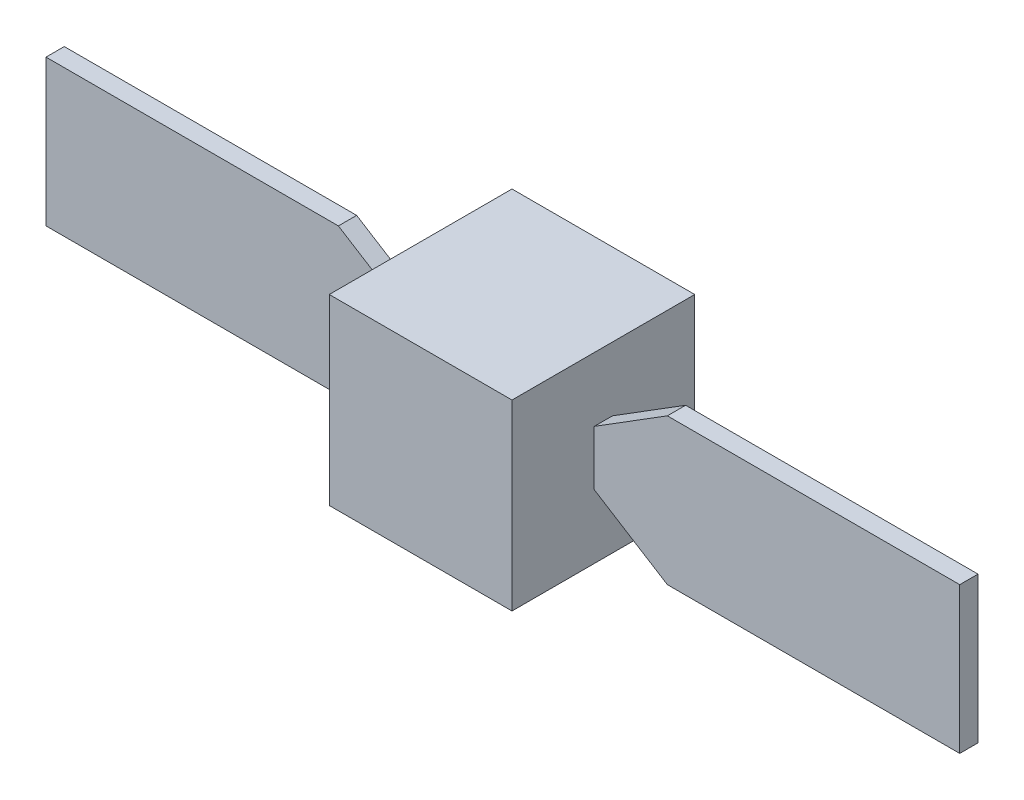
ISO-10303-21;
HEADER;
FILE_DESCRIPTION(('STEP AP214'),'2;1');
FILE_NAME('part.step','',(''),(''),'','','');
FILE_SCHEMA(('AUTOMOTIVE_DESIGN { 1 0 10303 214 1 1 1 1 }'));
ENDSEC;
DATA;
#1=APPLICATION_CONTEXT('core data for automotive mechanical design processes');
#2=APPLICATION_PROTOCOL_DEFINITION('international standard','automotive_design',2000,#1);
#3=PRODUCT_CONTEXT('',#1,'mechanical');
#4=PRODUCT('Part','Part','',(#3));
#5=PRODUCT_RELATED_PRODUCT_CATEGORY('part','',(#4));
#6=PRODUCT_DEFINITION_FORMATION('','',#4);
#7=PRODUCT_DEFINITION_CONTEXT('part definition',#1,'design');
#8=PRODUCT_DEFINITION('design','',#6,#7);
#9=PRODUCT_DEFINITION_SHAPE('','',#8);
#10=(LENGTH_UNIT() NAMED_UNIT(*) SI_UNIT(.MILLI.,.METRE.));
#11=(NAMED_UNIT(*) PLANE_ANGLE_UNIT() SI_UNIT($,.RADIAN.));
#12=(NAMED_UNIT(*) SI_UNIT($,.STERADIAN.) SOLID_ANGLE_UNIT());
#13=UNCERTAINTY_MEASURE_WITH_UNIT(LENGTH_MEASURE(1.E-05),#10,'distance_accuracy_value','');
#14=(GEOMETRIC_REPRESENTATION_CONTEXT(3) GLOBAL_UNCERTAINTY_ASSIGNED_CONTEXT((#13)) GLOBAL_UNIT_ASSIGNED_CONTEXT((#10,
#11,#12)) REPRESENTATION_CONTEXT('',''));
#15=CARTESIAN_POINT('',(0.,0.,0.));
#16=DIRECTION('',(0.,0.,1.));
#17=DIRECTION('',(1.,0.,0.));
#18=AXIS2_PLACEMENT_3D('',#15,#16,#17);
#19=CARTESIAN_POINT('',(0.,-50.,50.));
#20=DIRECTION('',(0.,1.,0.));
#21=DIRECTION('',(0.,0.,1.));
#22=AXIS2_PLACEMENT_3D('',#19,#20,#21);
#23=PLANE('',#22);
#24=DIRECTION('',(1.,0.,0.));
#25=VECTOR('',#24,1.);
#26=CARTESIAN_POINT('',(0.,-50.,-50.));
#27=LINE('',#26,#25);
#28=CARTESIAN_POINT('',(-50.,-50.,-50.));
#29=VERTEX_POINT('',#28);
#30=CARTESIAN_POINT('',(50.,-50.,-50.));
#31=VERTEX_POINT('',#30);
#32=EDGE_CURVE('E243',#29,#31,#27,.T.);
#33=ORIENTED_EDGE('',*,*,#32,.T.);
#34=DIRECTION('',(0.,0.,-1.));
#35=VECTOR('',#34,1.);
#36=CARTESIAN_POINT('',(50.,-50.,50.));
#37=LINE('',#36,#35);
#38=CARTESIAN_POINT('',(50.,-50.,50.));
#39=VERTEX_POINT('',#38);
#40=EDGE_CURVE('E11',#39,#31,#37,.T.);
#41=ORIENTED_EDGE('',*,*,#40,.F.);
#42=DIRECTION('',(1.,0.,0.));
#43=VECTOR('',#42,1.);
#44=CARTESIAN_POINT('',(0.,-50.,50.));
#45=LINE('',#44,#43);
#46=CARTESIAN_POINT('',(-50.,-50.,50.));
#47=VERTEX_POINT('',#46);
#48=EDGE_CURVE('E244',#47,#39,#45,.T.);
#49=ORIENTED_EDGE('',*,*,#48,.F.);
#50=DIRECTION('',(0.,0.,-1.));
#51=VECTOR('',#50,1.);
#52=CARTESIAN_POINT('',(-50.,-50.,50.));
#53=LINE('',#52,#51);
#54=EDGE_CURVE('E256',#47,#29,#53,.T.);
#55=ORIENTED_EDGE('',*,*,#54,.T.);
#56=EDGE_LOOP('',(#33,#41,#49,#55));
#57=FACE_BOUND('',#56,.T.);
#58=ADVANCED_FACE('F33',(#57),#23,.F.);
#59=CARTESIAN_POINT('',(50.,0.,50.));
#60=DIRECTION('',(-1.,0.,0.));
#61=DIRECTION('',(0.,0.,1.));
#62=AXIS2_PLACEMENT_3D('',#59,#60,#61);
#63=PLANE('',#62);
#64=DIRECTION('',(0.,0.,-1.));
#65=VECTOR('',#64,1.);
#66=CARTESIAN_POINT('',(50.,-15.,5.));
#67=LINE('',#66,#65);
#68=CARTESIAN_POINT('',(50.,-15.,5.));
#69=VERTEX_POINT('',#68);
#70=CARTESIAN_POINT('',(50.,-15.,-5.));
#71=VERTEX_POINT('',#70);
#72=EDGE_CURVE('E47',#69,#71,#67,.T.);
#73=ORIENTED_EDGE('',*,*,#72,.F.);
#74=DIRECTION('',(0.,1.,0.));
#75=VECTOR('',#74,1.);
#76=CARTESIAN_POINT('',(50.,0.,5.));
#77=LINE('',#76,#75);
#78=CARTESIAN_POINT('',(50.,15.,5.));
#79=VERTEX_POINT('',#78);
#80=EDGE_CURVE('E52',#69,#79,#77,.T.);
#81=ORIENTED_EDGE('',*,*,#80,.T.);
#82=DIRECTION('',(0.,0.,-1.));
#83=VECTOR('',#82,1.);
#84=CARTESIAN_POINT('',(50.,15.,5.));
#85=LINE('',#84,#83);
#86=CARTESIAN_POINT('',(50.,15.,-5.));
#87=VERTEX_POINT('',#86);
#88=EDGE_CURVE('E192',#79,#87,#85,.T.);
#89=ORIENTED_EDGE('',*,*,#88,.T.);
#90=DIRECTION('',(0.,1.,0.));
#91=VECTOR('',#90,1.);
#92=CARTESIAN_POINT('',(50.,0.,-5.));
#93=LINE('',#92,#91);
#94=EDGE_CURVE('E163',#71,#87,#93,.T.);
#95=ORIENTED_EDGE('',*,*,#94,.F.);
#96=EDGE_LOOP('',(#73,#81,#89,#95));
#97=FACE_BOUND('',#96,.T.);
#98=DIRECTION('',(0.,1.,0.));
#99=VECTOR('',#98,1.);
#100=CARTESIAN_POINT('',(50.,0.,-50.));
#101=LINE('',#100,#99);
#102=CARTESIAN_POINT('',(50.,50.,-50.));
#103=VERTEX_POINT('',#102);
#104=EDGE_CURVE('E259',#31,#103,#101,.T.);
#105=ORIENTED_EDGE('',*,*,#104,.T.);
#106=DIRECTION('',(0.,0.,-1.));
#107=VECTOR('',#106,1.);
#108=CARTESIAN_POINT('',(50.,50.,50.));
#109=LINE('',#108,#107);
#110=CARTESIAN_POINT('',(50.,50.,50.));
#111=VERTEX_POINT('',#110);
#112=EDGE_CURVE('E40',#111,#103,#109,.T.);
#113=ORIENTED_EDGE('',*,*,#112,.F.);
#114=DIRECTION('',(0.,1.,0.));
#115=VECTOR('',#114,1.);
#116=CARTESIAN_POINT('',(50.,0.,50.));
#117=LINE('',#116,#115);
#118=EDGE_CURVE('E247',#39,#111,#117,.T.);
#119=ORIENTED_EDGE('',*,*,#118,.F.);
#120=ORIENTED_EDGE('',*,*,#40,.T.);
#121=EDGE_LOOP('',(#105,#113,#119,#120));
#122=FACE_BOUND('',#121,.T.);
#123=ADVANCED_FACE('F275',(#97,#122),#63,.F.);
#124=CARTESIAN_POINT('',(0.,50.,50.));
#125=DIRECTION('',(0.,1.,0.));
#126=DIRECTION('',(0.,0.,1.));
#127=AXIS2_PLACEMENT_3D('',#124,#125,#126);
#128=PLANE('',#127);
#129=DIRECTION('',(1.,0.,0.));
#130=VECTOR('',#129,1.);
#131=CARTESIAN_POINT('',(0.,50.,-50.));
#132=LINE('',#131,#130);
#133=CARTESIAN_POINT('',(-50.,50.,-50.));
#134=VERTEX_POINT('',#133);
#135=EDGE_CURVE('E262',#134,#103,#132,.T.);
#136=ORIENTED_EDGE('',*,*,#135,.F.);
#137=DIRECTION('',(0.,0.,-1.));
#138=VECTOR('',#137,1.);
#139=CARTESIAN_POINT('',(-50.,50.,50.));
#140=LINE('',#139,#138);
#141=CARTESIAN_POINT('',(-50.,50.,50.));
#142=VERTEX_POINT('',#141);
#143=EDGE_CURVE('E268',#142,#134,#140,.T.);
#144=ORIENTED_EDGE('',*,*,#143,.F.);
#145=DIRECTION('',(1.,0.,0.));
#146=VECTOR('',#145,1.);
#147=CARTESIAN_POINT('',(0.,50.,50.));
#148=LINE('',#147,#146);
#149=EDGE_CURVE('E250',#142,#111,#148,.T.);
#150=ORIENTED_EDGE('',*,*,#149,.T.);
#151=ORIENTED_EDGE('',*,*,#112,.T.);
#152=EDGE_LOOP('',(#136,#144,#150,#151));
#153=FACE_BOUND('',#152,.T.);
#154=ADVANCED_FACE('F272',(#153),#128,.T.);
#155=CARTESIAN_POINT('',(-50.,0.,50.));
#156=DIRECTION('',(-1.,0.,0.));
#157=DIRECTION('',(0.,0.,1.));
#158=AXIS2_PLACEMENT_3D('',#155,#156,#157);
#159=PLANE('',#158);
#160=DIRECTION('',(0.,1.,0.));
#161=VECTOR('',#160,1.);
#162=CARTESIAN_POINT('',(-50.,0.,5.));
#163=LINE('',#162,#161);
#164=CARTESIAN_POINT('',(-50.,-15.,5.));
#165=VERTEX_POINT('',#164);
#166=CARTESIAN_POINT('',(-50.,15.,5.));
#167=VERTEX_POINT('',#166);
#168=EDGE_CURVE('E205',#165,#167,#163,.T.);
#169=ORIENTED_EDGE('',*,*,#168,.F.);
#170=DIRECTION('',(0.,0.,-1.));
#171=VECTOR('',#170,1.);
#172=CARTESIAN_POINT('',(-50.,-15.,5.));
#173=LINE('',#172,#171);
#174=CARTESIAN_POINT('',(-50.,-15.,-5.));
#175=VERTEX_POINT('',#174);
#176=EDGE_CURVE('E237',#165,#175,#173,.T.);
#177=ORIENTED_EDGE('',*,*,#176,.T.);
#178=DIRECTION('',(0.,1.,0.));
#179=VECTOR('',#178,1.);
#180=CARTESIAN_POINT('',(-50.,0.,-5.));
#181=LINE('',#180,#179);
#182=CARTESIAN_POINT('',(-50.,15.,-5.));
#183=VERTEX_POINT('',#182);
#184=EDGE_CURVE('E218',#175,#183,#181,.T.);
#185=ORIENTED_EDGE('',*,*,#184,.T.);
#186=DIRECTION('',(0.,0.,-1.));
#187=VECTOR('',#186,1.);
#188=CARTESIAN_POINT('',(-50.,15.,5.));
#189=LINE('',#188,#187);
#190=EDGE_CURVE('E234',#167,#183,#189,.T.);
#191=ORIENTED_EDGE('',*,*,#190,.F.);
#192=EDGE_LOOP('',(#169,#177,#185,#191));
#193=FACE_BOUND('',#192,.T.);
#194=DIRECTION('',(0.,1.,0.));
#195=VECTOR('',#194,1.);
#196=CARTESIAN_POINT('',(-50.,0.,-50.));
#197=LINE('',#196,#195);
#198=EDGE_CURVE('E248',#29,#134,#197,.T.);
#199=ORIENTED_EDGE('',*,*,#198,.F.);
#200=ORIENTED_EDGE('',*,*,#54,.F.);
#201=DIRECTION('',(0.,1.,0.));
#202=VECTOR('',#201,1.);
#203=CARTESIAN_POINT('',(-50.,0.,50.));
#204=LINE('',#203,#202);
#205=EDGE_CURVE('E253',#47,#142,#204,.T.);
#206=ORIENTED_EDGE('',*,*,#205,.T.);
#207=ORIENTED_EDGE('',*,*,#143,.T.);
#208=EDGE_LOOP('',(#199,#200,#206,#207));
#209=FACE_BOUND('',#208,.T.);
#210=ADVANCED_FACE('F282',(#193,#209),#159,.T.);
#211=CARTESIAN_POINT('',(0.,0.,50.));
#212=DIRECTION('',(0.,0.,1.));
#213=DIRECTION('',(1.,0.,0.));
#214=AXIS2_PLACEMENT_3D('',#211,#212,#213);
#215=PLANE('',#214);
#216=ORIENTED_EDGE('',*,*,#48,.T.);
#217=ORIENTED_EDGE('',*,*,#118,.T.);
#218=ORIENTED_EDGE('',*,*,#149,.F.);
#219=ORIENTED_EDGE('',*,*,#205,.F.);
#220=EDGE_LOOP('',(#216,#217,#218,#219));
#221=FACE_BOUND('',#220,.T.);
#222=ADVANCED_FACE('F286',(#221),#215,.T.);
#223=CARTESIAN_POINT('',(0.,0.,-50.));
#224=DIRECTION('',(0.,0.,1.));
#225=DIRECTION('',(1.,0.,0.));
#226=AXIS2_PLACEMENT_3D('',#223,#224,#225);
#227=PLANE('',#226);
#228=ORIENTED_EDGE('',*,*,#32,.F.);
#229=ORIENTED_EDGE('',*,*,#198,.T.);
#230=ORIENTED_EDGE('',*,*,#135,.T.);
#231=ORIENTED_EDGE('',*,*,#104,.F.);
#232=EDGE_LOOP('',(#228,#229,#230,#231));
#233=FACE_BOUND('',#232,.T.);
#234=ADVANCED_FACE('F279',(#233),#227,.F.);
#235=CARTESIAN_POINT('',(0.,-40.,5.));
#236=DIRECTION('',(0.,1.,0.));
#237=DIRECTION('',(-1.,0.,0.));
#238=AXIS2_PLACEMENT_3D('',#235,#236,#237);
#239=PLANE('',#238);
#240=DIRECTION('',(1.,0.,0.));
#241=VECTOR('',#240,1.);
#242=CARTESIAN_POINT('',(0.,-40.,-5.));
#243=LINE('',#242,#241);
#244=CARTESIAN_POINT('',(-250.,-40.,-5.));
#245=VERTEX_POINT('',#244);
#246=CARTESIAN_POINT('',(-90.0149738538925,-40.,-5.));
#247=VERTEX_POINT('',#246);
#248=EDGE_CURVE('E153',#245,#247,#243,.T.);
#249=ORIENTED_EDGE('',*,*,#248,.T.);
#250=DIRECTION('',(0.,0.,-1.));
#251=VECTOR('',#250,1.);
#252=CARTESIAN_POINT('',(-90.0149738538925,-40.,5.));
#253=LINE('',#252,#251);
#254=CARTESIAN_POINT('',(-90.0149738538925,-40.,5.));
#255=VERTEX_POINT('',#254);
#256=EDGE_CURVE('E240',#255,#247,#253,.T.);
#257=ORIENTED_EDGE('',*,*,#256,.F.);
#258=DIRECTION('',(1.,0.,0.));
#259=VECTOR('',#258,1.);
#260=CARTESIAN_POINT('',(0.,-40.,5.));
#261=LINE('',#260,#259);
#262=CARTESIAN_POINT('',(-250.,-40.,5.));
#263=VERTEX_POINT('',#262);
#264=EDGE_CURVE('E199',#263,#255,#261,.T.);
#265=ORIENTED_EDGE('',*,*,#264,.F.);
#266=DIRECTION('',(0.,0.,-1.));
#267=VECTOR('',#266,1.);
#268=CARTESIAN_POINT('',(-250.,-40.,5.));
#269=LINE('',#268,#267);
#270=EDGE_CURVE('E213',#263,#245,#269,.T.);
#271=ORIENTED_EDGE('',*,*,#270,.T.);
#272=EDGE_LOOP('',(#249,#257,#265,#271));
#273=FACE_BOUND('',#272,.T.);
#274=ADVANCED_FACE('F302',(#273),#239,.F.);
#275=CARTESIAN_POINT('',(-7.29691781132972,11.6794390173744,5.));
#276=DIRECTION('',(-0.529856298963436,0.848087437973685,0.));
#277=DIRECTION('',(-0.848087437973686,-0.529856298963436,0.));
#278=AXIS2_PLACEMENT_3D('',#275,#276,#277);
#279=PLANE('',#278);
#280=DIRECTION('',(0.848087437973686,0.529856298963436,0.));
#281=VECTOR('',#280,1.);
#282=CARTESIAN_POINT('',(-7.29691781132972,11.6794390173744,-5.));
#283=LINE('',#282,#281);
#284=EDGE_CURVE('E216',#247,#175,#283,.T.);
#285=ORIENTED_EDGE('',*,*,#284,.T.);
#286=ORIENTED_EDGE('',*,*,#176,.F.);
#287=DIRECTION('',(0.848087437973686,0.529856298963436,0.));
#288=VECTOR('',#287,1.);
#289=CARTESIAN_POINT('',(-7.29691781132972,11.6794390173744,5.));
#290=LINE('',#289,#288);
#291=EDGE_CURVE('E202',#255,#165,#290,.T.);
#292=ORIENTED_EDGE('',*,*,#291,.F.);
#293=ORIENTED_EDGE('',*,*,#256,.T.);
#294=EDGE_LOOP('',(#285,#286,#292,#293));
#295=FACE_BOUND('',#294,.T.);
#296=ADVANCED_FACE('F307',(#295),#279,.F.);
#297=CARTESIAN_POINT('',(-7.30337078651687,-11.685393258427,5.));
#298=DIRECTION('',(-0.52999894000318,-0.847998304005088,0.));
#299=DIRECTION('',(0.847998304005088,-0.52999894000318,0.));
#300=AXIS2_PLACEMENT_3D('',#297,#298,#299);
#301=PLANE('',#300);
#302=DIRECTION('',(-0.847998304005088,0.52999894000318,0.));
#303=VECTOR('',#302,1.);
#304=CARTESIAN_POINT('',(-7.30337078651687,-11.685393258427,-5.));
#305=LINE('',#304,#303);
#306=CARTESIAN_POINT('',(-90.,40.,-5.));
#307=VERTEX_POINT('',#306);
#308=EDGE_CURVE('E221',#183,#307,#305,.T.);
#309=ORIENTED_EDGE('',*,*,#308,.T.);
#310=DIRECTION('',(0.,0.,-1.));
#311=VECTOR('',#310,1.);
#312=CARTESIAN_POINT('',(-90.,40.,5.));
#313=LINE('',#312,#311);
#314=CARTESIAN_POINT('',(-90.,40.,5.));
#315=VERTEX_POINT('',#314);
#316=EDGE_CURVE('E231',#315,#307,#313,.T.);
#317=ORIENTED_EDGE('',*,*,#316,.F.);
#318=DIRECTION('',(-0.847998304005088,0.52999894000318,0.));
#319=VECTOR('',#318,1.);
#320=CARTESIAN_POINT('',(-7.30337078651687,-11.685393258427,5.));
#321=LINE('',#320,#319);
#322=EDGE_CURVE('E207',#167,#315,#321,.T.);
#323=ORIENTED_EDGE('',*,*,#322,.F.);
#324=ORIENTED_EDGE('',*,*,#190,.T.);
#325=EDGE_LOOP('',(#309,#317,#323,#324));
#326=FACE_BOUND('',#325,.T.);
#327=ADVANCED_FACE('F311',(#326),#301,.F.);
#328=CARTESIAN_POINT('',(0.,40.,5.));
#329=DIRECTION('',(0.,-1.,0.));
#330=DIRECTION('',(0.,0.,-1.));
#331=AXIS2_PLACEMENT_3D('',#328,#329,#330);
#332=PLANE('',#331);
#333=DIRECTION('',(-1.,0.,0.));
#334=VECTOR('',#333,1.);
#335=CARTESIAN_POINT('',(0.,40.,-5.));
#336=LINE('',#335,#334);
#337=CARTESIAN_POINT('',(-250.,40.,-5.));
#338=VERTEX_POINT('',#337);
#339=EDGE_CURVE('E223',#307,#338,#336,.T.);
#340=ORIENTED_EDGE('',*,*,#339,.T.);
#341=DIRECTION('',(0.,0.,-1.));
#342=VECTOR('',#341,1.);
#343=CARTESIAN_POINT('',(-250.,40.,5.));
#344=LINE('',#343,#342);
#345=CARTESIAN_POINT('',(-250.,40.,5.));
#346=VERTEX_POINT('',#345);
#347=EDGE_CURVE('E228',#346,#338,#344,.T.);
#348=ORIENTED_EDGE('',*,*,#347,.F.);
#349=DIRECTION('',(-1.,0.,0.));
#350=VECTOR('',#349,1.);
#351=CARTESIAN_POINT('',(0.,40.,5.));
#352=LINE('',#351,#350);
#353=EDGE_CURVE('E209',#315,#346,#352,.T.);
#354=ORIENTED_EDGE('',*,*,#353,.F.);
#355=ORIENTED_EDGE('',*,*,#316,.T.);
#356=EDGE_LOOP('',(#340,#348,#354,#355));
#357=FACE_BOUND('',#356,.T.);
#358=ADVANCED_FACE('F315',(#357),#332,.F.);
#359=CARTESIAN_POINT('',(-250.,0.,5.));
#360=DIRECTION('',(1.,0.,0.));
#361=DIRECTION('',(0.,1.,0.));
#362=AXIS2_PLACEMENT_3D('',#359,#360,#361);
#363=PLANE('',#362);
#364=DIRECTION('',(0.,-1.,0.));
#365=VECTOR('',#364,1.);
#366=CARTESIAN_POINT('',(-250.,0.,-5.));
#367=LINE('',#366,#365);
#368=EDGE_CURVE('E203',#338,#245,#367,.T.);
#369=ORIENTED_EDGE('',*,*,#368,.T.);
#370=ORIENTED_EDGE('',*,*,#270,.F.);
#371=DIRECTION('',(0.,-1.,0.));
#372=VECTOR('',#371,1.);
#373=CARTESIAN_POINT('',(-250.,0.,5.));
#374=LINE('',#373,#372);
#375=EDGE_CURVE('E211',#346,#263,#374,.T.);
#376=ORIENTED_EDGE('',*,*,#375,.F.);
#377=ORIENTED_EDGE('',*,*,#347,.T.);
#378=EDGE_LOOP('',(#369,#370,#376,#377));
#379=FACE_BOUND('',#378,.T.);
#380=ADVANCED_FACE('F319',(#379),#363,.F.);
#381=CARTESIAN_POINT('',(0.,0.,5.));
#382=DIRECTION('',(0.,0.,1.));
#383=DIRECTION('',(1.,0.,0.));
#384=AXIS2_PLACEMENT_3D('',#381,#382,#383);
#385=PLANE('',#384);
#386=ORIENTED_EDGE('',*,*,#264,.T.);
#387=ORIENTED_EDGE('',*,*,#291,.T.);
#388=ORIENTED_EDGE('',*,*,#168,.T.);
#389=ORIENTED_EDGE('',*,*,#322,.T.);
#390=ORIENTED_EDGE('',*,*,#353,.T.);
#391=ORIENTED_EDGE('',*,*,#375,.T.);
#392=EDGE_LOOP('',(#386,#387,#388,#389,#390,#391));
#393=FACE_BOUND('',#392,.T.);
#394=ADVANCED_FACE('F323',(#393),#385,.T.);
#395=CARTESIAN_POINT('',(0.,0.,-5.));
#396=DIRECTION('',(0.,0.,1.));
#397=DIRECTION('',(1.,0.,0.));
#398=AXIS2_PLACEMENT_3D('',#395,#396,#397);
#399=PLANE('',#398);
#400=ORIENTED_EDGE('',*,*,#248,.F.);
#401=ORIENTED_EDGE('',*,*,#368,.F.);
#402=ORIENTED_EDGE('',*,*,#339,.F.);
#403=ORIENTED_EDGE('',*,*,#308,.F.);
#404=ORIENTED_EDGE('',*,*,#184,.F.);
#405=ORIENTED_EDGE('',*,*,#284,.F.);
#406=EDGE_LOOP('',(#400,#401,#402,#403,#404,#405));
#407=FACE_BOUND('',#406,.T.);
#408=ADVANCED_FACE('F325',(#407),#399,.F.);
#409=CARTESIAN_POINT('',(7.30337078651683,11.6853932584269,5.));
#410=DIRECTION('',(-0.52999894000318,-0.847998304005088,0.));
#411=DIRECTION('',(0.847998304005088,-0.52999894000318,0.));
#412=AXIS2_PLACEMENT_3D('',#409,#410,#411);
#413=PLANE('',#412);
#414=DIRECTION('',(-0.847998304005088,0.52999894000318,0.));
#415=VECTOR('',#414,1.);
#416=CARTESIAN_POINT('',(7.30337078651683,11.6853932584269,-5.));
#417=LINE('',#416,#415);
#418=CARTESIAN_POINT('',(90.,-40.,-5.));
#419=VERTEX_POINT('',#418);
#420=EDGE_CURVE('E148',#419,#71,#417,.T.);
#421=ORIENTED_EDGE('',*,*,#420,.F.);
#422=DIRECTION('',(0.,0.,-1.));
#423=VECTOR('',#422,1.);
#424=CARTESIAN_POINT('',(90.,-40.,5.));
#425=LINE('',#424,#423);
#426=CARTESIAN_POINT('',(90.,-40.,5.));
#427=VERTEX_POINT('',#426);
#428=EDGE_CURVE('E143',#427,#419,#425,.T.);
#429=ORIENTED_EDGE('',*,*,#428,.F.);
#430=DIRECTION('',(-0.847998304005088,0.52999894000318,0.));
#431=VECTOR('',#430,1.);
#432=CARTESIAN_POINT('',(7.30337078651683,11.6853932584269,5.));
#433=LINE('',#432,#431);
#434=EDGE_CURVE('E146',#427,#69,#433,.T.);
#435=ORIENTED_EDGE('',*,*,#434,.T.);
#436=ORIENTED_EDGE('',*,*,#72,.T.);
#437=EDGE_LOOP('',(#421,#429,#435,#436));
#438=FACE_BOUND('',#437,.T.);
#439=ADVANCED_FACE('F145',(#438),#413,.T.);
#440=CARTESIAN_POINT('',(0.,-40.,5.));
#441=DIRECTION('',(0.,-1.,0.));
#442=DIRECTION('',(1.,0.,0.));
#443=AXIS2_PLACEMENT_3D('',#440,#441,#442);
#444=PLANE('',#443);
#445=DIRECTION('',(-1.,0.,0.));
#446=VECTOR('',#445,1.);
#447=CARTESIAN_POINT('',(0.,-40.,-5.));
#448=LINE('',#447,#446);
#449=CARTESIAN_POINT('',(250.,-40.,-5.));
#450=VERTEX_POINT('',#449);
#451=EDGE_CURVE('E178',#450,#419,#448,.T.);
#452=ORIENTED_EDGE('',*,*,#451,.F.);
#453=DIRECTION('',(0.,0.,-1.));
#454=VECTOR('',#453,1.);
#455=CARTESIAN_POINT('',(250.,-40.,5.));
#456=LINE('',#455,#454);
#457=CARTESIAN_POINT('',(250.,-40.,5.));
#458=VERTEX_POINT('',#457);
#459=EDGE_CURVE('E154',#458,#450,#456,.T.);
#460=ORIENTED_EDGE('',*,*,#459,.F.);
#461=DIRECTION('',(-1.,0.,0.));
#462=VECTOR('',#461,1.);
#463=CARTESIAN_POINT('',(0.,-40.,5.));
#464=LINE('',#463,#462);
#465=EDGE_CURVE('E160',#458,#427,#464,.T.);
#466=ORIENTED_EDGE('',*,*,#465,.T.);
#467=ORIENTED_EDGE('',*,*,#428,.T.);
#468=EDGE_LOOP('',(#452,#460,#466,#467));
#469=FACE_BOUND('',#468,.T.);
#470=ADVANCED_FACE('F165',(#469),#444,.T.);
#471=CARTESIAN_POINT('',(250.,0.,5.));
#472=DIRECTION('',(1.,0.,0.));
#473=DIRECTION('',(0.,0.,-1.));
#474=AXIS2_PLACEMENT_3D('',#471,#472,#473);
#475=PLANE('',#474);
#476=DIRECTION('',(0.,-1.,0.));
#477=VECTOR('',#476,1.);
#478=CARTESIAN_POINT('',(250.,0.,-5.));
#479=LINE('',#478,#477);
#480=CARTESIAN_POINT('',(250.,40.,-5.));
#481=VERTEX_POINT('',#480);
#482=EDGE_CURVE('E180',#481,#450,#479,.T.);
#483=ORIENTED_EDGE('',*,*,#482,.F.);
#484=DIRECTION('',(0.,0.,-1.));
#485=VECTOR('',#484,1.);
#486=CARTESIAN_POINT('',(250.,40.,5.));
#487=LINE('',#486,#485);
#488=CARTESIAN_POINT('',(250.,40.,5.));
#489=VERTEX_POINT('',#488);
#490=EDGE_CURVE('E196',#489,#481,#487,.T.);
#491=ORIENTED_EDGE('',*,*,#490,.F.);
#492=DIRECTION('',(0.,-1.,0.));
#493=VECTOR('',#492,1.);
#494=CARTESIAN_POINT('',(250.,0.,5.));
#495=LINE('',#494,#493);
#496=EDGE_CURVE('E166',#489,#458,#495,.T.);
#497=ORIENTED_EDGE('',*,*,#496,.T.);
#498=ORIENTED_EDGE('',*,*,#459,.T.);
#499=EDGE_LOOP('',(#483,#491,#497,#498));
#500=FACE_BOUND('',#499,.T.);
#501=ADVANCED_FACE('F336',(#500),#475,.T.);
#502=CARTESIAN_POINT('',(0.,40.,5.));
#503=DIRECTION('',(0.,1.,0.));
#504=DIRECTION('',(-1.,0.,0.));
#505=AXIS2_PLACEMENT_3D('',#502,#503,#504);
#506=PLANE('',#505);
#507=DIRECTION('',(1.,0.,0.));
#508=VECTOR('',#507,1.);
#509=CARTESIAN_POINT('',(0.,40.,-5.));
#510=LINE('',#509,#508);
#511=CARTESIAN_POINT('',(90.,40.,-5.));
#512=VERTEX_POINT('',#511);
#513=EDGE_CURVE('E183',#512,#481,#510,.T.);
#514=ORIENTED_EDGE('',*,*,#513,.F.);
#515=DIRECTION('',(0.,0.,-1.));
#516=VECTOR('',#515,1.);
#517=CARTESIAN_POINT('',(90.,40.,5.));
#518=LINE('',#517,#516);
#519=CARTESIAN_POINT('',(90.,40.,5.));
#520=VERTEX_POINT('',#519);
#521=EDGE_CURVE('E194',#520,#512,#518,.T.);
#522=ORIENTED_EDGE('',*,*,#521,.F.);
#523=DIRECTION('',(1.,0.,0.));
#524=VECTOR('',#523,1.);
#525=CARTESIAN_POINT('',(0.,40.,5.));
#526=LINE('',#525,#524);
#527=EDGE_CURVE('E168',#520,#489,#526,.T.);
#528=ORIENTED_EDGE('',*,*,#527,.T.);
#529=ORIENTED_EDGE('',*,*,#490,.T.);
#530=EDGE_LOOP('',(#514,#522,#528,#529));
#531=FACE_BOUND('',#530,.T.);
#532=ADVANCED_FACE('F339',(#531),#506,.T.);
#533=CARTESIAN_POINT('',(7.30337078651687,-11.685393258427,5.));
#534=DIRECTION('',(-0.52999894000318,0.847998304005088,0.));
#535=DIRECTION('',(-0.847998304005088,-0.52999894000318,0.));
#536=AXIS2_PLACEMENT_3D('',#533,#534,#535);
#537=PLANE('',#536);
#538=DIRECTION('',(0.847998304005088,0.52999894000318,0.));
#539=VECTOR('',#538,1.);
#540=CARTESIAN_POINT('',(7.30337078651687,-11.685393258427,-5.));
#541=LINE('',#540,#539);
#542=EDGE_CURVE('E186',#87,#512,#541,.T.);
#543=ORIENTED_EDGE('',*,*,#542,.F.);
#544=ORIENTED_EDGE('',*,*,#88,.F.);
#545=DIRECTION('',(0.847998304005088,0.52999894000318,0.));
#546=VECTOR('',#545,1.);
#547=CARTESIAN_POINT('',(7.30337078651687,-11.685393258427,5.));
#548=LINE('',#547,#546);
#549=EDGE_CURVE('E173',#79,#520,#548,.T.);
#550=ORIENTED_EDGE('',*,*,#549,.T.);
#551=ORIENTED_EDGE('',*,*,#521,.T.);
#552=EDGE_LOOP('',(#543,#544,#550,#551));
#553=FACE_BOUND('',#552,.T.);
#554=ADVANCED_FACE('F343',(#553),#537,.T.);
#555=CARTESIAN_POINT('',(0.,0.,5.));
#556=DIRECTION('',(0.,0.,1.));
#557=DIRECTION('',(1.,0.,0.));
#558=AXIS2_PLACEMENT_3D('',#555,#556,#557);
#559=PLANE('',#558);
#560=ORIENTED_EDGE('',*,*,#434,.F.);
#561=ORIENTED_EDGE('',*,*,#465,.F.);
#562=ORIENTED_EDGE('',*,*,#496,.F.);
#563=ORIENTED_EDGE('',*,*,#527,.F.);
#564=ORIENTED_EDGE('',*,*,#549,.F.);
#565=ORIENTED_EDGE('',*,*,#80,.F.);
#566=EDGE_LOOP('',(#560,#561,#562,#563,#564,#565));
#567=FACE_BOUND('',#566,.T.);
#568=ADVANCED_FACE('F158',(#567),#559,.T.);
#569=CARTESIAN_POINT('',(0.,0.,-5.));
#570=DIRECTION('',(0.,0.,1.));
#571=DIRECTION('',(1.,0.,0.));
#572=AXIS2_PLACEMENT_3D('',#569,#570,#571);
#573=PLANE('',#572);
#574=ORIENTED_EDGE('',*,*,#420,.T.);
#575=ORIENTED_EDGE('',*,*,#94,.T.);
#576=ORIENTED_EDGE('',*,*,#542,.T.);
#577=ORIENTED_EDGE('',*,*,#513,.T.);
#578=ORIENTED_EDGE('',*,*,#482,.T.);
#579=ORIENTED_EDGE('',*,*,#451,.T.);
#580=EDGE_LOOP('',(#574,#575,#576,#577,#578,#579));
#581=FACE_BOUND('',#580,.T.);
#582=ADVANCED_FACE('F348',(#581),#573,.F.);
#583=CLOSED_SHELL('',(#58,#123,#154,#210,#222,#234,#274,#296,#327,#358,#380,#394,#408,#439,#470,
#501,#532,#554,#568,#582));
#584=MANIFOLD_SOLID_BREP('B2',#583);
#585=ADVANCED_BREP_SHAPE_REPRESENTATION('',(#18,#584),#14);
#586=SHAPE_DEFINITION_REPRESENTATION(#9,#585);
ENDSEC;
END-ISO-10303-21;
